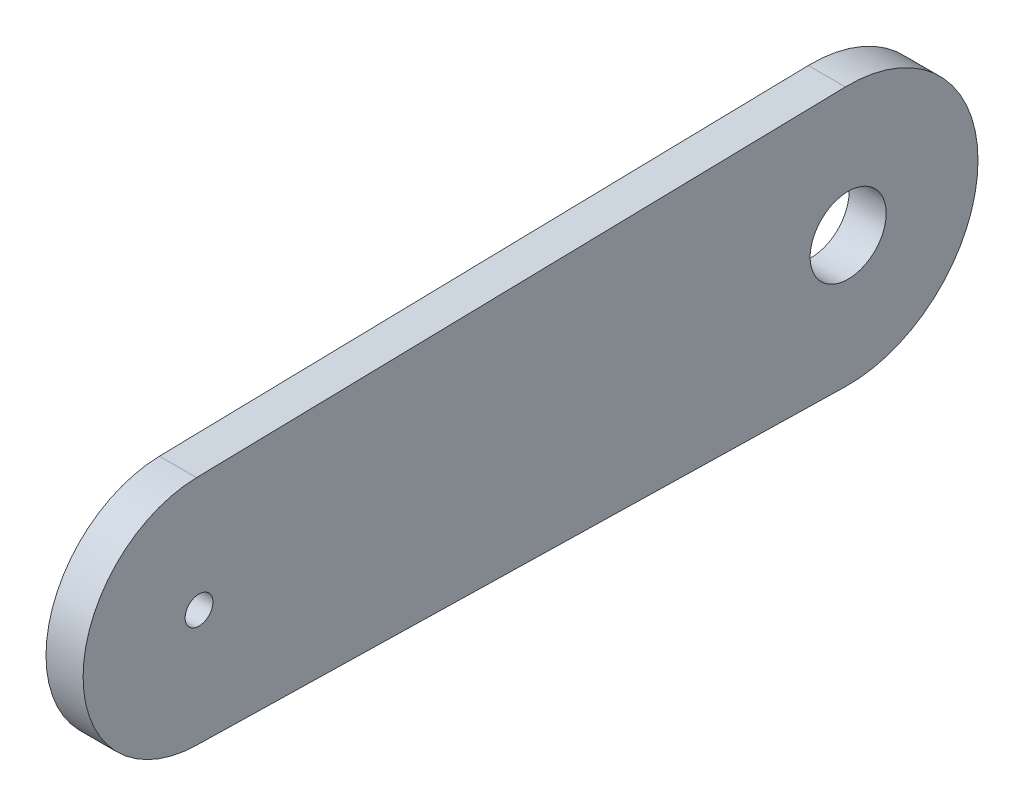
ISO-10303-21;
HEADER;
FILE_DESCRIPTION(('STEP AP214'),'2;1');
FILE_NAME('part.step','',(''),(''),'','','');
FILE_SCHEMA(('AUTOMOTIVE_DESIGN { 1 0 10303 214 1 1 1 1 }'));
ENDSEC;
DATA;
#1=APPLICATION_CONTEXT('core data for automotive mechanical design processes');
#2=APPLICATION_PROTOCOL_DEFINITION('international standard','automotive_design',2000,#1);
#3=PRODUCT_CONTEXT('',#1,'mechanical');
#4=PRODUCT('Part','Part','',(#3));
#5=PRODUCT_RELATED_PRODUCT_CATEGORY('part','',(#4));
#6=PRODUCT_DEFINITION_FORMATION('','',#4);
#7=PRODUCT_DEFINITION_CONTEXT('part definition',#1,'design');
#8=PRODUCT_DEFINITION('design','',#6,#7);
#9=PRODUCT_DEFINITION_SHAPE('','',#8);
#10=(LENGTH_UNIT() NAMED_UNIT(*) SI_UNIT(.MILLI.,.METRE.));
#11=(NAMED_UNIT(*) PLANE_ANGLE_UNIT() SI_UNIT($,.RADIAN.));
#12=(NAMED_UNIT(*) SI_UNIT($,.STERADIAN.) SOLID_ANGLE_UNIT());
#13=UNCERTAINTY_MEASURE_WITH_UNIT(LENGTH_MEASURE(1.E-05),#10,'distance_accuracy_value','');
#14=(GEOMETRIC_REPRESENTATION_CONTEXT(3) GLOBAL_UNCERTAINTY_ASSIGNED_CONTEXT((#13)) GLOBAL_UNIT_ASSIGNED_CONTEXT((#10,
#11,#12)) REPRESENTATION_CONTEXT('',''));
#15=CARTESIAN_POINT('',(0.,0.,0.));
#16=DIRECTION('',(0.,0.,1.));
#17=DIRECTION('',(1.,0.,0.));
#18=AXIS2_PLACEMENT_3D('',#15,#16,#17);
#19=CARTESIAN_POINT('',(4.,0.,70.));
#20=DIRECTION('',(1.,0.,0.));
#21=DIRECTION('',(0.,0.,-1.));
#22=AXIS2_PLACEMENT_3D('',#19,#20,#21);
#23=PLANE('',#22);
#24=CARTESIAN_POINT('',(4.,0.,0.));
#25=DIRECTION('',(1.,0.,0.));
#26=DIRECTION('',(0.,0.,-1.));
#27=AXIS2_PLACEMENT_3D('',#24,#25,#26);
#28=CIRCLE('',#27,4.1);
#29=CARTESIAN_POINT('',(4.,0.,-4.1));
#30=VERTEX_POINT('',#29);
#31=EDGE_CURVE('E100',#30,#30,#28,.T.);
#32=ORIENTED_EDGE('',*,*,#31,.F.);
#33=EDGE_LOOP('',(#32));
#34=FACE_BOUND('',#33,.T.);
#35=CARTESIAN_POINT('',(4.,0.,70.));
#36=DIRECTION('',(1.,0.,0.));
#37=DIRECTION('',(0.,0.,-1.));
#38=AXIS2_PLACEMENT_3D('',#35,#36,#37);
#39=CIRCLE('',#38,12.5);
#40=CARTESIAN_POINT('',(4.,12.4971297725126,70.2678571428571));
#41=VERTEX_POINT('',#40);
#42=CARTESIAN_POINT('',(4.,-12.4971297725126,70.2678571428571));
#43=VERTEX_POINT('',#42);
#44=EDGE_CURVE('E85',#41,#43,#39,.T.);
#45=ORIENTED_EDGE('',*,*,#44,.T.);
#46=DIRECTION('',(0.,-0.0214285714285713,-0.999770381801007));
#47=VECTOR('',#46,1.);
#48=CARTESIAN_POINT('',(4.,-12.4971297725126,70.2678571428571));
#49=LINE('',#48,#47);
#50=CARTESIAN_POINT('',(4.,-13.9967853452141,0.300000000000001));
#51=VERTEX_POINT('',#50);
#52=EDGE_CURVE('E80',#43,#51,#49,.T.);
#53=ORIENTED_EDGE('',*,*,#52,.T.);
#54=CARTESIAN_POINT('',(4.,0.,0.));
#55=DIRECTION('',(1.,0.,0.));
#56=DIRECTION('',(0.,0.,-1.));
#57=AXIS2_PLACEMENT_3D('',#54,#55,#56);
#58=CIRCLE('',#57,14.);
#59=CARTESIAN_POINT('',(4.,13.9967853452141,0.300000000000002));
#60=VERTEX_POINT('',#59);
#61=EDGE_CURVE('E83',#51,#60,#58,.T.);
#62=ORIENTED_EDGE('',*,*,#61,.T.);
#63=DIRECTION('',(0.,-0.0214285714285716,0.999770381801007));
#64=VECTOR('',#63,1.);
#65=CARTESIAN_POINT('',(4.,12.4971297725126,70.2678571428571));
#66=LINE('',#65,#64);
#67=EDGE_CURVE('E50',#60,#41,#66,.T.);
#68=ORIENTED_EDGE('',*,*,#67,.T.);
#69=EDGE_LOOP('',(#45,#53,#62,#68));
#70=FACE_BOUND('',#69,.T.);
#71=CARTESIAN_POINT('',(4.,0.,70.));
#72=DIRECTION('',(1.,0.,0.));
#73=DIRECTION('',(0.,0.,-1.));
#74=AXIS2_PLACEMENT_3D('',#71,#72,#73);
#75=CIRCLE('',#74,1.5);
#76=CARTESIAN_POINT('',(4.,0.,68.5));
#77=VERTEX_POINT('',#76);
#78=EDGE_CURVE('E115',#77,#77,#75,.T.);
#79=ORIENTED_EDGE('',*,*,#78,.F.);
#80=EDGE_LOOP('',(#79));
#81=FACE_BOUND('',#80,.T.);
#82=ADVANCED_FACE('F33',(#34,#70,#81),#23,.T.);
#83=CARTESIAN_POINT('',(0.,0.,70.));
#84=DIRECTION('',(1.,0.,0.));
#85=DIRECTION('',(0.,0.,-1.));
#86=AXIS2_PLACEMENT_3D('',#83,#84,#85);
#87=PLANE('',#86);
#88=CARTESIAN_POINT('',(0.,0.,0.));
#89=DIRECTION('',(1.,0.,0.));
#90=DIRECTION('',(0.,0.,-1.));
#91=AXIS2_PLACEMENT_3D('',#88,#89,#90);
#92=CIRCLE('',#91,4.1);
#93=CARTESIAN_POINT('',(0.,0.,-4.1));
#94=VERTEX_POINT('',#93);
#95=EDGE_CURVE('E112',#94,#94,#92,.T.);
#96=ORIENTED_EDGE('',*,*,#95,.T.);
#97=EDGE_LOOP('',(#96));
#98=FACE_BOUND('',#97,.T.);
#99=CARTESIAN_POINT('',(0.,0.,70.));
#100=DIRECTION('',(1.,0.,0.));
#101=DIRECTION('',(0.,0.,-1.));
#102=AXIS2_PLACEMENT_3D('',#99,#100,#101);
#103=CIRCLE('',#102,12.5);
#104=CARTESIAN_POINT('',(0.,12.4971297725126,70.2678571428571));
#105=VERTEX_POINT('',#104);
#106=CARTESIAN_POINT('',(0.,-12.4971297725126,70.2678571428571));
#107=VERTEX_POINT('',#106);
#108=EDGE_CURVE('E97',#105,#107,#103,.T.);
#109=ORIENTED_EDGE('',*,*,#108,.F.);
#110=DIRECTION('',(0.,-0.0214285714285716,0.999770381801007));
#111=VECTOR('',#110,1.);
#112=CARTESIAN_POINT('',(0.,12.4971297725126,70.2678571428571));
#113=LINE('',#112,#111);
#114=CARTESIAN_POINT('',(0.,13.9967853452141,0.300000000000002));
#115=VERTEX_POINT('',#114);
#116=EDGE_CURVE('E73',#115,#105,#113,.T.);
#117=ORIENTED_EDGE('',*,*,#116,.F.);
#118=CARTESIAN_POINT('',(0.,0.,0.));
#119=DIRECTION('',(1.,0.,0.));
#120=DIRECTION('',(0.,0.,-1.));
#121=AXIS2_PLACEMENT_3D('',#118,#119,#120);
#122=CIRCLE('',#121,14.);
#123=CARTESIAN_POINT('',(0.,-13.9967853452141,0.300000000000001));
#124=VERTEX_POINT('',#123);
#125=EDGE_CURVE('E67',#124,#115,#122,.T.);
#126=ORIENTED_EDGE('',*,*,#125,.F.);
#127=DIRECTION('',(0.,-0.0214285714285713,-0.999770381801007));
#128=VECTOR('',#127,1.);
#129=CARTESIAN_POINT('',(0.,-12.4971297725126,70.2678571428571));
#130=LINE('',#129,#128);
#131=EDGE_CURVE('E89',#107,#124,#130,.T.);
#132=ORIENTED_EDGE('',*,*,#131,.F.);
#133=EDGE_LOOP('',(#109,#117,#126,#132));
#134=FACE_BOUND('',#133,.T.);
#135=CARTESIAN_POINT('',(0.,0.,70.));
#136=DIRECTION('',(1.,0.,0.));
#137=DIRECTION('',(0.,0.,-1.));
#138=AXIS2_PLACEMENT_3D('',#135,#136,#137);
#139=CIRCLE('',#138,1.5);
#140=CARTESIAN_POINT('',(0.,0.,68.5));
#141=VERTEX_POINT('',#140);
#142=EDGE_CURVE('E118',#141,#141,#139,.T.);
#143=ORIENTED_EDGE('',*,*,#142,.T.);
#144=EDGE_LOOP('',(#143));
#145=FACE_BOUND('',#144,.T.);
#146=ADVANCED_FACE('F108',(#98,#134,#145),#87,.F.);
#147=CARTESIAN_POINT('',(4.,0.,70.));
#148=DIRECTION('',(-1.,0.,0.));
#149=DIRECTION('',(0.,0.,1.));
#150=AXIS2_PLACEMENT_3D('',#147,#148,#149);
#151=CYLINDRICAL_SURFACE('',#150,12.5);
#152=ORIENTED_EDGE('',*,*,#108,.T.);
#153=DIRECTION('',(-1.,0.,0.));
#154=VECTOR('',#153,1.);
#155=CARTESIAN_POINT('',(4.,-12.4971297725126,70.2678571428571));
#156=LINE('',#155,#154);
#157=EDGE_CURVE('E11',#43,#107,#156,.T.);
#158=ORIENTED_EDGE('',*,*,#157,.F.);
#159=ORIENTED_EDGE('',*,*,#44,.F.);
#160=DIRECTION('',(-1.,0.,0.));
#161=VECTOR('',#160,1.);
#162=CARTESIAN_POINT('',(4.,12.4971297725126,70.2678571428571));
#163=LINE('',#162,#161);
#164=EDGE_CURVE('E93',#41,#105,#163,.T.);
#165=ORIENTED_EDGE('',*,*,#164,.T.);
#166=EDGE_LOOP('',(#152,#158,#159,#165));
#167=FACE_BOUND('',#166,.T.);
#168=ADVANCED_FACE('F35',(#167),#151,.T.);
#169=CARTESIAN_POINT('',(4.,-12.4971297725126,70.2678571428571));
#170=DIRECTION('',(0.,0.999770381801007,-0.0214285714285713));
#171=DIRECTION('',(0.,0.0214285714285713,0.999770381801007));
#172=AXIS2_PLACEMENT_3D('',#169,#170,#171);
#173=PLANE('',#172);
#174=ORIENTED_EDGE('',*,*,#131,.T.);
#175=DIRECTION('',(-1.,0.,0.));
#176=VECTOR('',#175,1.);
#177=CARTESIAN_POINT('',(4.,-13.9967853452141,0.300000000000001));
#178=LINE('',#177,#176);
#179=EDGE_CURVE('E42',#51,#124,#178,.T.);
#180=ORIENTED_EDGE('',*,*,#179,.F.);
#181=ORIENTED_EDGE('',*,*,#52,.F.);
#182=ORIENTED_EDGE('',*,*,#157,.T.);
#183=EDGE_LOOP('',(#174,#180,#181,#182));
#184=FACE_BOUND('',#183,.T.);
#185=ADVANCED_FACE('F88',(#184),#173,.F.);
#186=CARTESIAN_POINT('',(4.,0.,0.));
#187=DIRECTION('',(-1.,0.,0.));
#188=DIRECTION('',(0.,0.,1.));
#189=AXIS2_PLACEMENT_3D('',#186,#187,#188);
#190=CYLINDRICAL_SURFACE('',#189,14.);
#191=ORIENTED_EDGE('',*,*,#125,.T.);
#192=DIRECTION('',(-1.,0.,0.));
#193=VECTOR('',#192,1.);
#194=CARTESIAN_POINT('',(4.,13.9967853452141,0.300000000000002));
#195=LINE('',#194,#193);
#196=EDGE_CURVE('E90',#60,#115,#195,.T.);
#197=ORIENTED_EDGE('',*,*,#196,.F.);
#198=ORIENTED_EDGE('',*,*,#61,.F.);
#199=ORIENTED_EDGE('',*,*,#179,.T.);
#200=EDGE_LOOP('',(#191,#197,#198,#199));
#201=FACE_BOUND('',#200,.T.);
#202=ADVANCED_FACE('F91',(#201),#190,.T.);
#203=CARTESIAN_POINT('',(4.,12.4971297725126,70.2678571428571));
#204=DIRECTION('',(0.,-0.999770381801007,-0.0214285714285716));
#205=DIRECTION('',(0.,0.0214285714285716,-0.999770381801007));
#206=AXIS2_PLACEMENT_3D('',#203,#204,#205);
#207=PLANE('',#206);
#208=ORIENTED_EDGE('',*,*,#116,.T.);
#209=ORIENTED_EDGE('',*,*,#164,.F.);
#210=ORIENTED_EDGE('',*,*,#67,.F.);
#211=ORIENTED_EDGE('',*,*,#196,.T.);
#212=EDGE_LOOP('',(#208,#209,#210,#211));
#213=FACE_BOUND('',#212,.T.);
#214=ADVANCED_FACE('F105',(#213),#207,.F.);
#215=CARTESIAN_POINT('',(4.,0.,0.));
#216=DIRECTION('',(-1.,0.,0.));
#217=DIRECTION('',(0.,0.,1.));
#218=AXIS2_PLACEMENT_3D('',#215,#216,#217);
#219=CYLINDRICAL_SURFACE('',#218,4.1);
#220=ORIENTED_EDGE('',*,*,#31,.T.);
#221=EDGE_LOOP('',(#220));
#222=FACE_BOUND('',#221,.T.);
#223=ORIENTED_EDGE('',*,*,#95,.F.);
#224=EDGE_LOOP('',(#223));
#225=FACE_BOUND('',#224,.T.);
#226=ADVANCED_FACE('F136',(#222,#225),#219,.F.);
#227=CARTESIAN_POINT('',(4.,0.,70.));
#228=DIRECTION('',(-1.,0.,0.));
#229=DIRECTION('',(0.,0.,1.));
#230=AXIS2_PLACEMENT_3D('',#227,#228,#229);
#231=CYLINDRICAL_SURFACE('',#230,1.5);
#232=ORIENTED_EDGE('',*,*,#78,.T.);
#233=EDGE_LOOP('',(#232));
#234=FACE_BOUND('',#233,.T.);
#235=ORIENTED_EDGE('',*,*,#142,.F.);
#236=EDGE_LOOP('',(#235));
#237=FACE_BOUND('',#236,.T.);
#238=ADVANCED_FACE('F124',(#234,#237),#231,.F.);
#239=CLOSED_SHELL('',(#82,#146,#168,#185,#202,#214,#226,#238));
#240=MANIFOLD_SOLID_BREP('B2',#239);
#241=ADVANCED_BREP_SHAPE_REPRESENTATION('',(#18,#240),#14);
#242=SHAPE_DEFINITION_REPRESENTATION(#9,#241);
ENDSEC;
END-ISO-10303-21;
